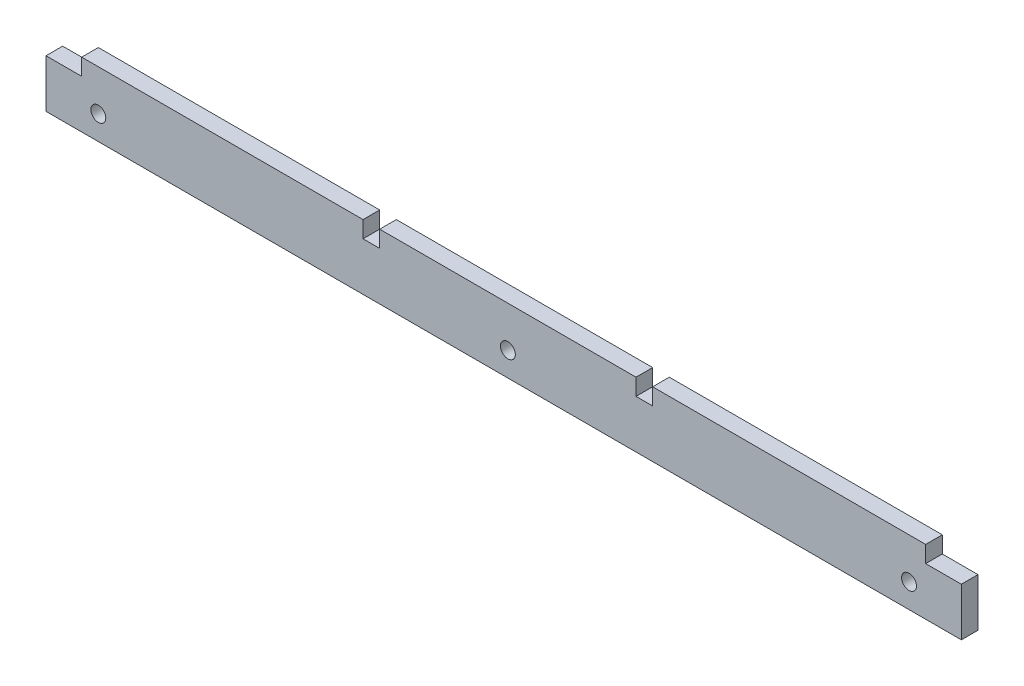
ISO-10303-21;
HEADER;
FILE_DESCRIPTION(('STEP AP214'),'2;1');
FILE_NAME('part.step','',(''),(''),'','','');
FILE_SCHEMA(('AUTOMOTIVE_DESIGN { 1 0 10303 214 1 1 1 1 }'));
ENDSEC;
DATA;
#1=APPLICATION_CONTEXT('core data for automotive mechanical design processes');
#2=APPLICATION_PROTOCOL_DEFINITION('international standard','automotive_design',2000,#1);
#3=PRODUCT_CONTEXT('',#1,'mechanical');
#4=PRODUCT('Part','Part','',(#3));
#5=PRODUCT_RELATED_PRODUCT_CATEGORY('part','',(#4));
#6=PRODUCT_DEFINITION_FORMATION('','',#4);
#7=PRODUCT_DEFINITION_CONTEXT('part definition',#1,'design');
#8=PRODUCT_DEFINITION('design','',#6,#7);
#9=PRODUCT_DEFINITION_SHAPE('','',#8);
#10=(LENGTH_UNIT() NAMED_UNIT(*) SI_UNIT(.MILLI.,.METRE.));
#11=(NAMED_UNIT(*) PLANE_ANGLE_UNIT() SI_UNIT($,.RADIAN.));
#12=(NAMED_UNIT(*) SI_UNIT($,.STERADIAN.) SOLID_ANGLE_UNIT());
#13=UNCERTAINTY_MEASURE_WITH_UNIT(LENGTH_MEASURE(1.E-05),#10,'distance_accuracy_value','');
#14=(GEOMETRIC_REPRESENTATION_CONTEXT(3) GLOBAL_UNCERTAINTY_ASSIGNED_CONTEXT((#13)) GLOBAL_UNIT_ASSIGNED_CONTEXT((#10,
#11,#12)) REPRESENTATION_CONTEXT('',''));
#15=CARTESIAN_POINT('',(0.,0.,0.));
#16=DIRECTION('',(0.,0.,1.));
#17=DIRECTION('',(1.,0.,0.));
#18=AXIS2_PLACEMENT_3D('',#15,#16,#17);
#19=CARTESIAN_POINT('',(0.,0.,3.175));
#20=DIRECTION('',(0.,0.,-1.));
#21=DIRECTION('',(-1.,0.,0.));
#22=AXIS2_PLACEMENT_3D('',#19,#20,#21);
#23=PLANE('',#22);
#24=CARTESIAN_POINT('',(5917.60447630178,2662.13498281213,3.175));
#25=DIRECTION('',(0.,0.,1.));
#26=DIRECTION('',(1.,0.,0.));
#27=AXIS2_PLACEMENT_3D('',#24,#25,#26);
#28=CIRCLE('',#27,1.42240000000005);
#29=CARTESIAN_POINT('',(5919.02687630178,2662.13498281213,3.175));
#30=VERTEX_POINT('',#29);
#31=EDGE_CURVE('E339',#30,#30,#28,.T.);
#32=ORIENTED_EDGE('',*,*,#31,.F.);
#33=EDGE_LOOP('',(#32));
#34=FACE_BOUND('',#33,.T.);
#35=DIRECTION('',(-1.,-2.60952644170987E-13,0.));
#36=VECTOR('',#35,1.);
#37=CARTESIAN_POINT('',(6082.24727630178,2666.73238281215,3.175));
#38=LINE('',#37,#36);
#39=CARTESIAN_POINT('',(6082.24727630178,2666.73238281215,3.175));
#40=VERTEX_POINT('',#39);
#41=CARTESIAN_POINT('',(6075.44007630178,2666.73238281215,3.175));
#42=VERTEX_POINT('',#41);
#43=EDGE_CURVE('E209',#40,#42,#38,.T.);
#44=ORIENTED_EDGE('',*,*,#43,.T.);
#45=DIRECTION('',(0.,1.,0.));
#46=VECTOR('',#45,1.);
#47=CARTESIAN_POINT('',(6075.44007630178,2666.73238281215,3.175));
#48=LINE('',#47,#46);
#49=CARTESIAN_POINT('',(6075.44007630178,2669.90738281213,3.175));
#50=VERTEX_POINT('',#49);
#51=EDGE_CURVE('E117',#42,#50,#48,.T.);
#52=ORIENTED_EDGE('',*,*,#51,.T.);
#53=DIRECTION('',(-1.,0.,0.));
#54=VECTOR('',#53,1.);
#55=CARTESIAN_POINT('',(6075.44007630178,2669.90738281213,3.175));
#56=LINE('',#55,#54);
#57=CARTESIAN_POINT('',(6023.35737630178,2669.90738281213,3.175));
#58=VERTEX_POINT('',#57);
#59=EDGE_CURVE('E248',#50,#58,#56,.T.);
#60=ORIENTED_EDGE('',*,*,#59,.T.);
#61=DIRECTION('',(0.,-1.,0.));
#62=VECTOR('',#61,1.);
#63=CARTESIAN_POINT('',(6023.35737630178,2666.73238281214,3.175));
#64=LINE('',#63,#62);
#65=CARTESIAN_POINT('',(6023.35737630178,2666.73238281214,3.175));
#66=VERTEX_POINT('',#65);
#67=EDGE_CURVE('E267',#58,#66,#64,.T.);
#68=ORIENTED_EDGE('',*,*,#67,.T.);
#69=DIRECTION('',(-1.,-2.79741234551325E-13,0.));
#70=VECTOR('',#69,1.);
#71=CARTESIAN_POINT('',(6023.35737630178,2666.73238281214,3.175));
#72=LINE('',#71,#70);
#73=CARTESIAN_POINT('',(6020.18237630178,2666.73238281214,3.175));
#74=VERTEX_POINT('',#73);
#75=EDGE_CURVE('E264',#66,#74,#72,.T.);
#76=ORIENTED_EDGE('',*,*,#75,.T.);
#77=DIRECTION('',(0.,1.,0.));
#78=VECTOR('',#77,1.);
#79=CARTESIAN_POINT('',(6020.18237630178,2666.73238281214,3.175));
#80=LINE('',#79,#78);
#81=CARTESIAN_POINT('',(6020.18237630178,2669.90738281213,3.175));
#82=VERTEX_POINT('',#81);
#83=EDGE_CURVE('E266',#74,#82,#80,.T.);
#84=ORIENTED_EDGE('',*,*,#83,.T.);
#85=DIRECTION('',(-1.,0.,0.));
#86=VECTOR('',#85,1.);
#87=CARTESIAN_POINT('',(6020.18237630178,2669.90738281213,3.175));
#88=LINE('',#87,#86);
#89=CARTESIAN_POINT('',(5971.27977243303,2669.90738281213,3.175));
#90=VERTEX_POINT('',#89);
#91=EDGE_CURVE('E269',#82,#90,#88,.T.);
#92=ORIENTED_EDGE('',*,*,#91,.T.);
#93=DIRECTION('',(0.,-1.,0.));
#94=VECTOR('',#93,1.);
#95=CARTESIAN_POINT('',(5971.27977243303,2669.90738281213,3.175));
#96=LINE('',#95,#94);
#97=CARTESIAN_POINT('',(5971.27977243303,2666.73238281213,3.175));
#98=VERTEX_POINT('',#97);
#99=EDGE_CURVE('E275',#90,#98,#96,.T.);
#100=ORIENTED_EDGE('',*,*,#99,.T.);
#101=DIRECTION('',(-1.,0.,0.));
#102=VECTOR('',#101,1.);
#103=CARTESIAN_POINT('',(5971.27977243303,2666.73238281213,3.175));
#104=LINE('',#103,#102);
#105=CARTESIAN_POINT('',(5968.10477243303,2666.73238281213,3.175));
#106=VERTEX_POINT('',#105);
#107=EDGE_CURVE('E277',#98,#106,#104,.T.);
#108=ORIENTED_EDGE('',*,*,#107,.T.);
#109=DIRECTION('',(0.,1.,0.));
#110=VECTOR('',#109,1.);
#111=CARTESIAN_POINT('',(5968.10477243303,2669.90738281213,3.175));
#112=LINE('',#111,#110);
#113=CARTESIAN_POINT('',(5968.10477243303,2669.90738281213,3.175));
#114=VERTEX_POINT('',#113);
#115=EDGE_CURVE('E279',#106,#114,#112,.T.);
#116=ORIENTED_EDGE('',*,*,#115,.T.);
#117=DIRECTION('',(-1.,0.,0.));
#118=VECTOR('',#117,1.);
#119=CARTESIAN_POINT('',(5968.10477243303,2669.90738281213,3.175));
#120=LINE('',#119,#118);
#121=CARTESIAN_POINT('',(5914.42947630178,2669.90738281213,3.175));
#122=VERTEX_POINT('',#121);
#123=EDGE_CURVE('E281',#114,#122,#120,.T.);
#124=ORIENTED_EDGE('',*,*,#123,.T.);
#125=DIRECTION('',(0.,-1.,0.));
#126=VECTOR('',#125,1.);
#127=CARTESIAN_POINT('',(5914.42947630178,2666.73238281211,3.175));
#128=LINE('',#127,#126);
#129=CARTESIAN_POINT('',(5914.42947630178,2666.73238281211,3.175));
#130=VERTEX_POINT('',#129);
#131=EDGE_CURVE('E283',#122,#130,#128,.T.);
#132=ORIENTED_EDGE('',*,*,#131,.T.);
#133=DIRECTION('',(-1.,-1.95714483128189E-13,0.));
#134=VECTOR('',#133,1.);
#135=CARTESIAN_POINT('',(5914.42947630178,2666.73238281211,3.175));
#136=LINE('',#135,#134);
#137=CARTESIAN_POINT('',(5907.62227630178,2666.73238281211,3.175));
#138=VERTEX_POINT('',#137);
#139=EDGE_CURVE('E160',#130,#138,#136,.T.);
#140=ORIENTED_EDGE('',*,*,#139,.T.);
#141=DIRECTION('',(0.,-1.,0.));
#142=VECTOR('',#141,1.);
#143=CARTESIAN_POINT('',(5907.62227630178,2657.53758281213,3.175));
#144=LINE('',#143,#142);
#145=CARTESIAN_POINT('',(5907.62227630178,2657.53758281213,3.175));
#146=VERTEX_POINT('',#145);
#147=EDGE_CURVE('E154',#138,#146,#144,.T.);
#148=ORIENTED_EDGE('',*,*,#147,.T.);
#149=DIRECTION('',(1.,0.,0.));
#150=VECTOR('',#149,1.);
#151=CARTESIAN_POINT('',(6082.24727630178,2657.53758281213,3.175));
#152=LINE('',#151,#150);
#153=CARTESIAN_POINT('',(6082.24727630178,2657.53758281213,3.175));
#154=VERTEX_POINT('',#153);
#155=EDGE_CURVE('E158',#146,#154,#152,.T.);
#156=ORIENTED_EDGE('',*,*,#155,.T.);
#157=DIRECTION('',(0.,1.,0.));
#158=VECTOR('',#157,1.);
#159=CARTESIAN_POINT('',(6082.24727630178,2657.53758281213,3.175));
#160=LINE('',#159,#158);
#161=EDGE_CURVE('E50',#154,#40,#160,.T.);
#162=ORIENTED_EDGE('',*,*,#161,.T.);
#163=EDGE_LOOP('',(#44,#52,#60,#68,#76,#84,#92,#100,#108,#116,#124,#132,#140,#148,#156,#162));
#164=FACE_BOUND('',#163,.T.);
#165=CARTESIAN_POINT('',(5995.73107436741,2662.13498281213,3.175));
#166=DIRECTION('',(0.,0.,1.));
#167=DIRECTION('',(1.,0.,0.));
#168=AXIS2_PLACEMENT_3D('',#165,#166,#167);
#169=CIRCLE('',#168,1.42240000000005);
#170=CARTESIAN_POINT('',(5997.1534743674,2662.13498281213,3.175));
#171=VERTEX_POINT('',#170);
#172=EDGE_CURVE('E182',#171,#171,#169,.T.);
#173=ORIENTED_EDGE('',*,*,#172,.F.);
#174=EDGE_LOOP('',(#173));
#175=FACE_BOUND('',#174,.T.);
#176=CARTESIAN_POINT('',(6072.26507630178,2662.13498281213,3.175));
#177=DIRECTION('',(0.,0.,1.));
#178=DIRECTION('',(1.,0.,0.));
#179=AXIS2_PLACEMENT_3D('',#176,#177,#178);
#180=CIRCLE('',#179,1.42240000000005);
#181=CARTESIAN_POINT('',(6073.68747630178,2662.13498281213,3.175));
#182=VERTEX_POINT('',#181);
#183=EDGE_CURVE('E330',#182,#182,#180,.T.);
#184=ORIENTED_EDGE('',*,*,#183,.F.);
#185=EDGE_LOOP('',(#184));
#186=FACE_BOUND('',#185,.T.);
#187=ADVANCED_FACE('F33',(#34,#164,#175,#186),#23,.F.);
#188=CARTESIAN_POINT('',(0.,0.,0.));
#189=DIRECTION('',(0.,0.,-1.));
#190=DIRECTION('',(-1.,0.,0.));
#191=AXIS2_PLACEMENT_3D('',#188,#189,#190);
#192=PLANE('',#191);
#193=CARTESIAN_POINT('',(5917.60447630178,2662.13498281213,0.));
#194=DIRECTION('',(0.,0.,1.));
#195=DIRECTION('',(1.,0.,0.));
#196=AXIS2_PLACEMENT_3D('',#193,#194,#195);
#197=CIRCLE('',#196,1.42240000000005);
#198=CARTESIAN_POINT('',(5919.02687630178,2662.13498281213,0.));
#199=VERTEX_POINT('',#198);
#200=EDGE_CURVE('E336',#199,#199,#197,.T.);
#201=ORIENTED_EDGE('',*,*,#200,.T.);
#202=EDGE_LOOP('',(#201));
#203=FACE_BOUND('',#202,.T.);
#204=DIRECTION('',(-1.,-2.60952644170987E-13,0.));
#205=VECTOR('',#204,1.);
#206=CARTESIAN_POINT('',(6082.24727630178,2666.73238281215,0.));
#207=LINE('',#206,#205);
#208=CARTESIAN_POINT('',(6082.24727630178,2666.73238281215,0.));
#209=VERTEX_POINT('',#208);
#210=CARTESIAN_POINT('',(6075.44007630178,2666.73238281215,0.));
#211=VERTEX_POINT('',#210);
#212=EDGE_CURVE('E178',#209,#211,#207,.T.);
#213=ORIENTED_EDGE('',*,*,#212,.F.);
#214=DIRECTION('',(0.,1.,0.));
#215=VECTOR('',#214,1.);
#216=CARTESIAN_POINT('',(6082.24727630178,2657.53758281213,0.));
#217=LINE('',#216,#215);
#218=CARTESIAN_POINT('',(6082.24727630178,2657.53758281213,0.));
#219=VERTEX_POINT('',#218);
#220=EDGE_CURVE('E109',#219,#209,#217,.T.);
#221=ORIENTED_EDGE('',*,*,#220,.F.);
#222=DIRECTION('',(1.,0.,0.));
#223=VECTOR('',#222,1.);
#224=CARTESIAN_POINT('',(6082.24727630178,2657.53758281213,0.));
#225=LINE('',#224,#223);
#226=CARTESIAN_POINT('',(5907.62227630178,2657.53758281213,0.));
#227=VERTEX_POINT('',#226);
#228=EDGE_CURVE('E103',#227,#219,#225,.T.);
#229=ORIENTED_EDGE('',*,*,#228,.F.);
#230=DIRECTION('',(0.,-1.,0.));
#231=VECTOR('',#230,1.);
#232=CARTESIAN_POINT('',(5907.62227630178,2657.53758281213,0.));
#233=LINE('',#232,#231);
#234=CARTESIAN_POINT('',(5907.62227630178,2666.73238281211,0.));
#235=VERTEX_POINT('',#234);
#236=EDGE_CURVE('E168',#235,#227,#233,.T.);
#237=ORIENTED_EDGE('',*,*,#236,.F.);
#238=DIRECTION('',(-1.,-1.95714483128189E-13,0.));
#239=VECTOR('',#238,1.);
#240=CARTESIAN_POINT('',(5914.42947630178,2666.73238281211,0.));
#241=LINE('',#240,#239);
#242=CARTESIAN_POINT('',(5914.42947630178,2666.73238281211,0.));
#243=VERTEX_POINT('',#242);
#244=EDGE_CURVE('E204',#243,#235,#241,.T.);
#245=ORIENTED_EDGE('',*,*,#244,.F.);
#246=DIRECTION('',(0.,-1.,0.));
#247=VECTOR('',#246,1.);
#248=CARTESIAN_POINT('',(5914.42947630178,2666.73238281211,0.));
#249=LINE('',#248,#247);
#250=CARTESIAN_POINT('',(5914.42947630178,2669.90738281213,0.));
#251=VERTEX_POINT('',#250);
#252=EDGE_CURVE('E202',#251,#243,#249,.T.);
#253=ORIENTED_EDGE('',*,*,#252,.F.);
#254=DIRECTION('',(-1.,0.,0.));
#255=VECTOR('',#254,1.);
#256=CARTESIAN_POINT('',(5968.10477243303,2669.90738281213,0.));
#257=LINE('',#256,#255);
#258=CARTESIAN_POINT('',(5968.10477243303,2669.90738281213,0.));
#259=VERTEX_POINT('',#258);
#260=EDGE_CURVE('E200',#259,#251,#257,.T.);
#261=ORIENTED_EDGE('',*,*,#260,.F.);
#262=DIRECTION('',(0.,1.,0.));
#263=VECTOR('',#262,1.);
#264=CARTESIAN_POINT('',(5968.10477243303,2669.90738281213,0.));
#265=LINE('',#264,#263);
#266=CARTESIAN_POINT('',(5968.10477243303,2666.73238281213,0.));
#267=VERTEX_POINT('',#266);
#268=EDGE_CURVE('E198',#267,#259,#265,.T.);
#269=ORIENTED_EDGE('',*,*,#268,.F.);
#270=DIRECTION('',(-1.,0.,0.));
#271=VECTOR('',#270,1.);
#272=CARTESIAN_POINT('',(5971.27977243303,2666.73238281213,0.));
#273=LINE('',#272,#271);
#274=CARTESIAN_POINT('',(5971.27977243303,2666.73238281213,0.));
#275=VERTEX_POINT('',#274);
#276=EDGE_CURVE('E196',#275,#267,#273,.T.);
#277=ORIENTED_EDGE('',*,*,#276,.F.);
#278=DIRECTION('',(0.,-1.,0.));
#279=VECTOR('',#278,1.);
#280=CARTESIAN_POINT('',(5971.27977243303,2669.90738281213,0.));
#281=LINE('',#280,#279);
#282=CARTESIAN_POINT('',(5971.27977243303,2669.90738281213,0.));
#283=VERTEX_POINT('',#282);
#284=EDGE_CURVE('E194',#283,#275,#281,.T.);
#285=ORIENTED_EDGE('',*,*,#284,.F.);
#286=DIRECTION('',(-1.,0.,0.));
#287=VECTOR('',#286,1.);
#288=CARTESIAN_POINT('',(6020.18237630178,2669.90738281213,0.));
#289=LINE('',#288,#287);
#290=CARTESIAN_POINT('',(6020.18237630178,2669.90738281213,0.));
#291=VERTEX_POINT('',#290);
#292=EDGE_CURVE('E192',#291,#283,#289,.T.);
#293=ORIENTED_EDGE('',*,*,#292,.F.);
#294=DIRECTION('',(0.,1.,0.));
#295=VECTOR('',#294,1.);
#296=CARTESIAN_POINT('',(6020.18237630178,2666.73238281214,0.));
#297=LINE('',#296,#295);
#298=CARTESIAN_POINT('',(6020.18237630178,2666.73238281214,0.));
#299=VERTEX_POINT('',#298);
#300=EDGE_CURVE('E190',#299,#291,#297,.T.);
#301=ORIENTED_EDGE('',*,*,#300,.F.);
#302=DIRECTION('',(-1.,-2.79741234551325E-13,0.));
#303=VECTOR('',#302,1.);
#304=CARTESIAN_POINT('',(6023.35737630178,2666.73238281214,0.));
#305=LINE('',#304,#303);
#306=CARTESIAN_POINT('',(6023.35737630178,2666.73238281214,0.));
#307=VERTEX_POINT('',#306);
#308=EDGE_CURVE('E188',#307,#299,#305,.T.);
#309=ORIENTED_EDGE('',*,*,#308,.F.);
#310=DIRECTION('',(0.,-1.,0.));
#311=VECTOR('',#310,1.);
#312=CARTESIAN_POINT('',(6023.35737630178,2666.73238281214,0.));
#313=LINE('',#312,#311);
#314=CARTESIAN_POINT('',(6023.35737630178,2669.90738281213,0.));
#315=VERTEX_POINT('',#314);
#316=EDGE_CURVE('E186',#315,#307,#313,.T.);
#317=ORIENTED_EDGE('',*,*,#316,.F.);
#318=DIRECTION('',(-1.,0.,0.));
#319=VECTOR('',#318,1.);
#320=CARTESIAN_POINT('',(6075.44007630178,2669.90738281213,0.));
#321=LINE('',#320,#319);
#322=CARTESIAN_POINT('',(6075.44007630178,2669.90738281213,0.));
#323=VERTEX_POINT('',#322);
#324=EDGE_CURVE('E184',#323,#315,#321,.T.);
#325=ORIENTED_EDGE('',*,*,#324,.F.);
#326=DIRECTION('',(0.,1.,0.));
#327=VECTOR('',#326,1.);
#328=CARTESIAN_POINT('',(6075.44007630178,2666.73238281215,0.));
#329=LINE('',#328,#327);
#330=EDGE_CURVE('E181',#211,#323,#329,.T.);
#331=ORIENTED_EDGE('',*,*,#330,.F.);
#332=EDGE_LOOP('',(#213,#221,#229,#237,#245,#253,#261,#269,#277,#285,#293,#301,#309,#317,#325,#331));
#333=FACE_BOUND('',#332,.T.);
#334=CARTESIAN_POINT('',(5995.73107436741,2662.13498281213,0.));
#335=DIRECTION('',(0.,0.,1.));
#336=DIRECTION('',(1.,0.,0.));
#337=AXIS2_PLACEMENT_3D('',#334,#335,#336);
#338=CIRCLE('',#337,1.42240000000005);
#339=CARTESIAN_POINT('',(5997.1534743674,2662.13498281213,0.));
#340=VERTEX_POINT('',#339);
#341=EDGE_CURVE('E342',#340,#340,#338,.T.);
#342=ORIENTED_EDGE('',*,*,#341,.T.);
#343=EDGE_LOOP('',(#342));
#344=FACE_BOUND('',#343,.T.);
#345=CARTESIAN_POINT('',(6072.26507630178,2662.13498281213,0.));
#346=DIRECTION('',(0.,0.,1.));
#347=DIRECTION('',(1.,0.,0.));
#348=AXIS2_PLACEMENT_3D('',#345,#346,#347);
#349=CIRCLE('',#348,1.42240000000005);
#350=CARTESIAN_POINT('',(6073.68747630178,2662.13498281213,0.));
#351=VERTEX_POINT('',#350);
#352=EDGE_CURVE('E333',#351,#351,#349,.T.);
#353=ORIENTED_EDGE('',*,*,#352,.T.);
#354=EDGE_LOOP('',(#353));
#355=FACE_BOUND('',#354,.T.);
#356=ADVANCED_FACE('F252',(#203,#333,#344,#355),#192,.T.);
#357=CARTESIAN_POINT('',(6082.24727630178,2666.73238281215,3.175));
#358=DIRECTION('',(2.60952644170987E-13,-1.,0.));
#359=DIRECTION('',(1.,2.60952644170987E-13,0.));
#360=AXIS2_PLACEMENT_3D('',#357,#358,#359);
#361=PLANE('',#360);
#362=ORIENTED_EDGE('',*,*,#212,.T.);
#363=DIRECTION('',(0.,0.,-1.));
#364=VECTOR('',#363,1.);
#365=CARTESIAN_POINT('',(6075.44007630178,2666.73238281215,3.175));
#366=LINE('',#365,#364);
#367=EDGE_CURVE('E11',#42,#211,#366,.T.);
#368=ORIENTED_EDGE('',*,*,#367,.F.);
#369=ORIENTED_EDGE('',*,*,#43,.F.);
#370=DIRECTION('',(0.,0.,-1.));
#371=VECTOR('',#370,1.);
#372=CARTESIAN_POINT('',(6082.24727630178,2666.73238281215,3.175));
#373=LINE('',#372,#371);
#374=EDGE_CURVE('E174',#40,#209,#373,.T.);
#375=ORIENTED_EDGE('',*,*,#374,.T.);
#376=EDGE_LOOP('',(#362,#368,#369,#375));
#377=FACE_BOUND('',#376,.T.);
#378=ADVANCED_FACE('F35',(#377),#361,.F.);
#379=CARTESIAN_POINT('',(6075.44007630178,2666.73238281215,3.175));
#380=DIRECTION('',(-1.,0.,0.));
#381=DIRECTION('',(0.,0.,1.));
#382=AXIS2_PLACEMENT_3D('',#379,#380,#381);
#383=PLANE('',#382);
#384=ORIENTED_EDGE('',*,*,#330,.T.);
#385=DIRECTION('',(0.,0.,-1.));
#386=VECTOR('',#385,1.);
#387=CARTESIAN_POINT('',(6075.44007630178,2669.90738281213,3.175));
#388=LINE('',#387,#386);
#389=EDGE_CURVE('E42',#50,#323,#388,.T.);
#390=ORIENTED_EDGE('',*,*,#389,.F.);
#391=ORIENTED_EDGE('',*,*,#51,.F.);
#392=ORIENTED_EDGE('',*,*,#367,.T.);
#393=EDGE_LOOP('',(#384,#390,#391,#392));
#394=FACE_BOUND('',#393,.T.);
#395=ADVANCED_FACE('F483',(#394),#383,.F.);
#396=CARTESIAN_POINT('',(6075.44007630178,2669.90738281213,3.175));
#397=DIRECTION('',(0.,-1.,0.));
#398=DIRECTION('',(0.,0.,-1.));
#399=AXIS2_PLACEMENT_3D('',#396,#397,#398);
#400=PLANE('',#399);
#401=ORIENTED_EDGE('',*,*,#324,.T.);
#402=DIRECTION('',(0.,0.,-1.));
#403=VECTOR('',#402,1.);
#404=CARTESIAN_POINT('',(6023.35737630178,2669.90738281213,3.175));
#405=LINE('',#404,#403);
#406=EDGE_CURVE('E240',#58,#315,#405,.T.);
#407=ORIENTED_EDGE('',*,*,#406,.F.);
#408=ORIENTED_EDGE('',*,*,#59,.F.);
#409=ORIENTED_EDGE('',*,*,#389,.T.);
#410=EDGE_LOOP('',(#401,#407,#408,#409));
#411=FACE_BOUND('',#410,.T.);
#412=ADVANCED_FACE('F246',(#411),#400,.F.);
#413=CARTESIAN_POINT('',(6023.35737630178,2666.73238281214,3.175));
#414=DIRECTION('',(1.,0.,0.));
#415=DIRECTION('',(0.,0.,-1.));
#416=AXIS2_PLACEMENT_3D('',#413,#414,#415);
#417=PLANE('',#416);
#418=ORIENTED_EDGE('',*,*,#316,.T.);
#419=DIRECTION('',(0.,0.,-1.));
#420=VECTOR('',#419,1.);
#421=CARTESIAN_POINT('',(6023.35737630178,2666.73238281214,3.175));
#422=LINE('',#421,#420);
#423=EDGE_CURVE('E237',#66,#307,#422,.T.);
#424=ORIENTED_EDGE('',*,*,#423,.F.);
#425=ORIENTED_EDGE('',*,*,#67,.F.);
#426=ORIENTED_EDGE('',*,*,#406,.T.);
#427=EDGE_LOOP('',(#418,#424,#425,#426));
#428=FACE_BOUND('',#427,.T.);
#429=ADVANCED_FACE('F258',(#428),#417,.F.);
#430=CARTESIAN_POINT('',(6023.35737630178,2666.73238281214,3.175));
#431=DIRECTION('',(2.79741234551325E-13,-1.,0.));
#432=DIRECTION('',(1.,2.79741234551325E-13,0.));
#433=AXIS2_PLACEMENT_3D('',#430,#431,#432);
#434=PLANE('',#433);
#435=ORIENTED_EDGE('',*,*,#308,.T.);
#436=DIRECTION('',(0.,0.,-1.));
#437=VECTOR('',#436,1.);
#438=CARTESIAN_POINT('',(6020.18237630178,2666.73238281214,3.175));
#439=LINE('',#438,#437);
#440=EDGE_CURVE('E234',#74,#299,#439,.T.);
#441=ORIENTED_EDGE('',*,*,#440,.F.);
#442=ORIENTED_EDGE('',*,*,#75,.F.);
#443=ORIENTED_EDGE('',*,*,#423,.T.);
#444=EDGE_LOOP('',(#435,#441,#442,#443));
#445=FACE_BOUND('',#444,.T.);
#446=ADVANCED_FACE('F262',(#445),#434,.F.);
#447=CARTESIAN_POINT('',(6020.18237630178,2666.73238281214,3.175));
#448=DIRECTION('',(-1.,0.,0.));
#449=DIRECTION('',(0.,0.,1.));
#450=AXIS2_PLACEMENT_3D('',#447,#448,#449);
#451=PLANE('',#450);
#452=ORIENTED_EDGE('',*,*,#300,.T.);
#453=DIRECTION('',(0.,0.,-1.));
#454=VECTOR('',#453,1.);
#455=CARTESIAN_POINT('',(6020.18237630178,2669.90738281213,3.175));
#456=LINE('',#455,#454);
#457=EDGE_CURVE('E231',#82,#291,#456,.T.);
#458=ORIENTED_EDGE('',*,*,#457,.F.);
#459=ORIENTED_EDGE('',*,*,#83,.F.);
#460=ORIENTED_EDGE('',*,*,#440,.T.);
#461=EDGE_LOOP('',(#452,#458,#459,#460));
#462=FACE_BOUND('',#461,.T.);
#463=ADVANCED_FACE('F448',(#462),#451,.F.);
#464=CARTESIAN_POINT('',(6020.18237630178,2669.90738281213,3.175));
#465=DIRECTION('',(0.,-1.,0.));
#466=DIRECTION('',(0.,0.,-1.));
#467=AXIS2_PLACEMENT_3D('',#464,#465,#466);
#468=PLANE('',#467);
#469=ORIENTED_EDGE('',*,*,#292,.T.);
#470=DIRECTION('',(0.,0.,-1.));
#471=VECTOR('',#470,1.);
#472=CARTESIAN_POINT('',(5971.27977243303,2669.90738281213,3.175));
#473=LINE('',#472,#471);
#474=EDGE_CURVE('E228',#90,#283,#473,.T.);
#475=ORIENTED_EDGE('',*,*,#474,.F.);
#476=ORIENTED_EDGE('',*,*,#91,.F.);
#477=ORIENTED_EDGE('',*,*,#457,.T.);
#478=EDGE_LOOP('',(#469,#475,#476,#477));
#479=FACE_BOUND('',#478,.T.);
#480=ADVANCED_FACE('F438',(#479),#468,.F.);
#481=CARTESIAN_POINT('',(5971.27977243303,2669.90738281213,3.175));
#482=DIRECTION('',(1.,0.,0.));
#483=DIRECTION('',(0.,0.,-1.));
#484=AXIS2_PLACEMENT_3D('',#481,#482,#483);
#485=PLANE('',#484);
#486=ORIENTED_EDGE('',*,*,#284,.T.);
#487=DIRECTION('',(0.,0.,-1.));
#488=VECTOR('',#487,1.);
#489=CARTESIAN_POINT('',(5971.27977243303,2666.73238281213,3.175));
#490=LINE('',#489,#488);
#491=EDGE_CURVE('E225',#98,#275,#490,.T.);
#492=ORIENTED_EDGE('',*,*,#491,.F.);
#493=ORIENTED_EDGE('',*,*,#99,.F.);
#494=ORIENTED_EDGE('',*,*,#474,.T.);
#495=EDGE_LOOP('',(#486,#492,#493,#494));
#496=FACE_BOUND('',#495,.T.);
#497=ADVANCED_FACE('F428',(#496),#485,.F.);
#498=CARTESIAN_POINT('',(5971.27977243303,2666.73238281213,3.175));
#499=DIRECTION('',(0.,-1.,0.));
#500=DIRECTION('',(0.,0.,-1.));
#501=AXIS2_PLACEMENT_3D('',#498,#499,#500);
#502=PLANE('',#501);
#503=ORIENTED_EDGE('',*,*,#276,.T.);
#504=DIRECTION('',(0.,0.,-1.));
#505=VECTOR('',#504,1.);
#506=CARTESIAN_POINT('',(5968.10477243303,2666.73238281213,3.175));
#507=LINE('',#506,#505);
#508=EDGE_CURVE('E222',#106,#267,#507,.T.);
#509=ORIENTED_EDGE('',*,*,#508,.F.);
#510=ORIENTED_EDGE('',*,*,#107,.F.);
#511=ORIENTED_EDGE('',*,*,#491,.T.);
#512=EDGE_LOOP('',(#503,#509,#510,#511));
#513=FACE_BOUND('',#512,.T.);
#514=ADVANCED_FACE('F418',(#513),#502,.F.);
#515=CARTESIAN_POINT('',(5968.10477243303,2669.90738281213,3.175));
#516=DIRECTION('',(-1.,0.,0.));
#517=DIRECTION('',(0.,0.,1.));
#518=AXIS2_PLACEMENT_3D('',#515,#516,#517);
#519=PLANE('',#518);
#520=ORIENTED_EDGE('',*,*,#268,.T.);
#521=DIRECTION('',(0.,0.,-1.));
#522=VECTOR('',#521,1.);
#523=CARTESIAN_POINT('',(5968.10477243303,2669.90738281213,3.175));
#524=LINE('',#523,#522);
#525=EDGE_CURVE('E219',#114,#259,#524,.T.);
#526=ORIENTED_EDGE('',*,*,#525,.F.);
#527=ORIENTED_EDGE('',*,*,#115,.F.);
#528=ORIENTED_EDGE('',*,*,#508,.T.);
#529=EDGE_LOOP('',(#520,#526,#527,#528));
#530=FACE_BOUND('',#529,.T.);
#531=ADVANCED_FACE('F408',(#530),#519,.F.);
#532=CARTESIAN_POINT('',(5968.10477243303,2669.90738281213,3.175));
#533=DIRECTION('',(0.,-1.,0.));
#534=DIRECTION('',(0.,0.,-1.));
#535=AXIS2_PLACEMENT_3D('',#532,#533,#534);
#536=PLANE('',#535);
#537=ORIENTED_EDGE('',*,*,#260,.T.);
#538=DIRECTION('',(0.,0.,-1.));
#539=VECTOR('',#538,1.);
#540=CARTESIAN_POINT('',(5914.42947630178,2669.90738281213,3.175));
#541=LINE('',#540,#539);
#542=EDGE_CURVE('E216',#122,#251,#541,.T.);
#543=ORIENTED_EDGE('',*,*,#542,.F.);
#544=ORIENTED_EDGE('',*,*,#123,.F.);
#545=ORIENTED_EDGE('',*,*,#525,.T.);
#546=EDGE_LOOP('',(#537,#543,#544,#545));
#547=FACE_BOUND('',#546,.T.);
#548=ADVANCED_FACE('F399',(#547),#536,.F.);
#549=CARTESIAN_POINT('',(5914.42947630178,2666.73238281211,3.175));
#550=DIRECTION('',(1.,0.,0.));
#551=DIRECTION('',(0.,0.,-1.));
#552=AXIS2_PLACEMENT_3D('',#549,#550,#551);
#553=PLANE('',#552);
#554=ORIENTED_EDGE('',*,*,#252,.T.);
#555=DIRECTION('',(0.,0.,-1.));
#556=VECTOR('',#555,1.);
#557=CARTESIAN_POINT('',(5914.42947630178,2666.73238281211,3.175));
#558=LINE('',#557,#556);
#559=EDGE_CURVE('E213',#130,#243,#558,.T.);
#560=ORIENTED_EDGE('',*,*,#559,.F.);
#561=ORIENTED_EDGE('',*,*,#131,.F.);
#562=ORIENTED_EDGE('',*,*,#542,.T.);
#563=EDGE_LOOP('',(#554,#560,#561,#562));
#564=FACE_BOUND('',#563,.T.);
#565=ADVANCED_FACE('F289',(#564),#553,.F.);
#566=CARTESIAN_POINT('',(5914.42947630178,2666.73238281211,3.175));
#567=DIRECTION('',(1.95714483128189E-13,-1.,0.));
#568=DIRECTION('',(1.,1.95714483128189E-13,0.));
#569=AXIS2_PLACEMENT_3D('',#566,#567,#568);
#570=PLANE('',#569);
#571=ORIENTED_EDGE('',*,*,#244,.T.);
#572=DIRECTION('',(0.,0.,-1.));
#573=VECTOR('',#572,1.);
#574=CARTESIAN_POINT('',(5907.62227630178,2666.73238281211,3.175));
#575=LINE('',#574,#573);
#576=EDGE_CURVE('E169',#138,#235,#575,.T.);
#577=ORIENTED_EDGE('',*,*,#576,.F.);
#578=ORIENTED_EDGE('',*,*,#139,.F.);
#579=ORIENTED_EDGE('',*,*,#559,.T.);
#580=EDGE_LOOP('',(#571,#577,#578,#579));
#581=FACE_BOUND('',#580,.T.);
#582=ADVANCED_FACE('F293',(#581),#570,.F.);
#583=CARTESIAN_POINT('',(5907.62227630178,2657.53758281213,3.175));
#584=DIRECTION('',(1.,0.,0.));
#585=DIRECTION('',(0.,1.,0.));
#586=AXIS2_PLACEMENT_3D('',#583,#584,#585);
#587=PLANE('',#586);
#588=ORIENTED_EDGE('',*,*,#236,.T.);
#589=DIRECTION('',(0.,0.,-1.));
#590=VECTOR('',#589,1.);
#591=CARTESIAN_POINT('',(5907.62227630178,2657.53758281213,3.175));
#592=LINE('',#591,#590);
#593=EDGE_CURVE('E165',#146,#227,#592,.T.);
#594=ORIENTED_EDGE('',*,*,#593,.F.);
#595=ORIENTED_EDGE('',*,*,#147,.F.);
#596=ORIENTED_EDGE('',*,*,#576,.T.);
#597=EDGE_LOOP('',(#588,#594,#595,#596));
#598=FACE_BOUND('',#597,.T.);
#599=ADVANCED_FACE('F166',(#598),#587,.F.);
#600=CARTESIAN_POINT('',(6082.24727630178,2657.53758281213,3.175));
#601=DIRECTION('',(0.,1.,0.));
#602=DIRECTION('',(-1.,0.,0.));
#603=AXIS2_PLACEMENT_3D('',#600,#601,#602);
#604=PLANE('',#603);
#605=ORIENTED_EDGE('',*,*,#228,.T.);
#606=DIRECTION('',(0.,0.,-1.));
#607=VECTOR('',#606,1.);
#608=CARTESIAN_POINT('',(6082.24727630178,2657.53758281213,3.175));
#609=LINE('',#608,#607);
#610=EDGE_CURVE('E170',#154,#219,#609,.T.);
#611=ORIENTED_EDGE('',*,*,#610,.F.);
#612=ORIENTED_EDGE('',*,*,#155,.F.);
#613=ORIENTED_EDGE('',*,*,#593,.T.);
#614=EDGE_LOOP('',(#605,#611,#612,#613));
#615=FACE_BOUND('',#614,.T.);
#616=ADVANCED_FACE('F172',(#615),#604,.F.);
#617=CARTESIAN_POINT('',(6082.24727630178,2657.53758281213,3.175));
#618=DIRECTION('',(-1.,0.,0.));
#619=DIRECTION('',(0.,-1.,0.));
#620=AXIS2_PLACEMENT_3D('',#617,#618,#619);
#621=PLANE('',#620);
#622=ORIENTED_EDGE('',*,*,#220,.T.);
#623=ORIENTED_EDGE('',*,*,#374,.F.);
#624=ORIENTED_EDGE('',*,*,#161,.F.);
#625=ORIENTED_EDGE('',*,*,#610,.T.);
#626=EDGE_LOOP('',(#622,#623,#624,#625));
#627=FACE_BOUND('',#626,.T.);
#628=ADVANCED_FACE('F297',(#627),#621,.F.);
#629=CARTESIAN_POINT('',(5995.73107436741,2662.13498281213,3.175));
#630=DIRECTION('',(0.,0.,-1.));
#631=DIRECTION('',(-1.,0.,0.));
#632=AXIS2_PLACEMENT_3D('',#629,#630,#631);
#633=CYLINDRICAL_SURFACE('',#632,1.42240000000005);
#634=ORIENTED_EDGE('',*,*,#172,.T.);
#635=EDGE_LOOP('',(#634));
#636=FACE_BOUND('',#635,.T.);
#637=ORIENTED_EDGE('',*,*,#341,.F.);
#638=EDGE_LOOP('',(#637));
#639=FACE_BOUND('',#638,.T.);
#640=ADVANCED_FACE('F299',(#636,#639),#633,.F.);
#641=CARTESIAN_POINT('',(5917.60447630178,2662.13498281213,3.175));
#642=DIRECTION('',(0.,0.,-1.));
#643=DIRECTION('',(-1.,0.,0.));
#644=AXIS2_PLACEMENT_3D('',#641,#642,#643);
#645=CYLINDRICAL_SURFACE('',#644,1.42240000000005);
#646=ORIENTED_EDGE('',*,*,#31,.T.);
#647=EDGE_LOOP('',(#646));
#648=FACE_BOUND('',#647,.T.);
#649=ORIENTED_EDGE('',*,*,#200,.F.);
#650=EDGE_LOOP('',(#649));
#651=FACE_BOUND('',#650,.T.);
#652=ADVANCED_FACE('F305',(#648,#651),#645,.F.);
#653=CARTESIAN_POINT('',(6072.26507630178,2662.13498281213,3.175));
#654=DIRECTION('',(0.,0.,-1.));
#655=DIRECTION('',(-1.,0.,0.));
#656=AXIS2_PLACEMENT_3D('',#653,#654,#655);
#657=CYLINDRICAL_SURFACE('',#656,1.42240000000005);
#658=ORIENTED_EDGE('',*,*,#183,.T.);
#659=EDGE_LOOP('',(#658));
#660=FACE_BOUND('',#659,.T.);
#661=ORIENTED_EDGE('',*,*,#352,.F.);
#662=EDGE_LOOP('',(#661));
#663=FACE_BOUND('',#662,.T.);
#664=ADVANCED_FACE('F321',(#660,#663),#657,.F.);
#665=CLOSED_SHELL('',(#187,#356,#378,#395,#412,#429,#446,#463,#480,#497,#514,#531,#548,#565,
#582,#599,#616,#628,#640,#652,#664));
#666=MANIFOLD_SOLID_BREP('B2',#665);
#667=ADVANCED_BREP_SHAPE_REPRESENTATION('',(#18,#666),#14);
#668=SHAPE_DEFINITION_REPRESENTATION(#9,#667);
ENDSEC;
END-ISO-10303-21;
